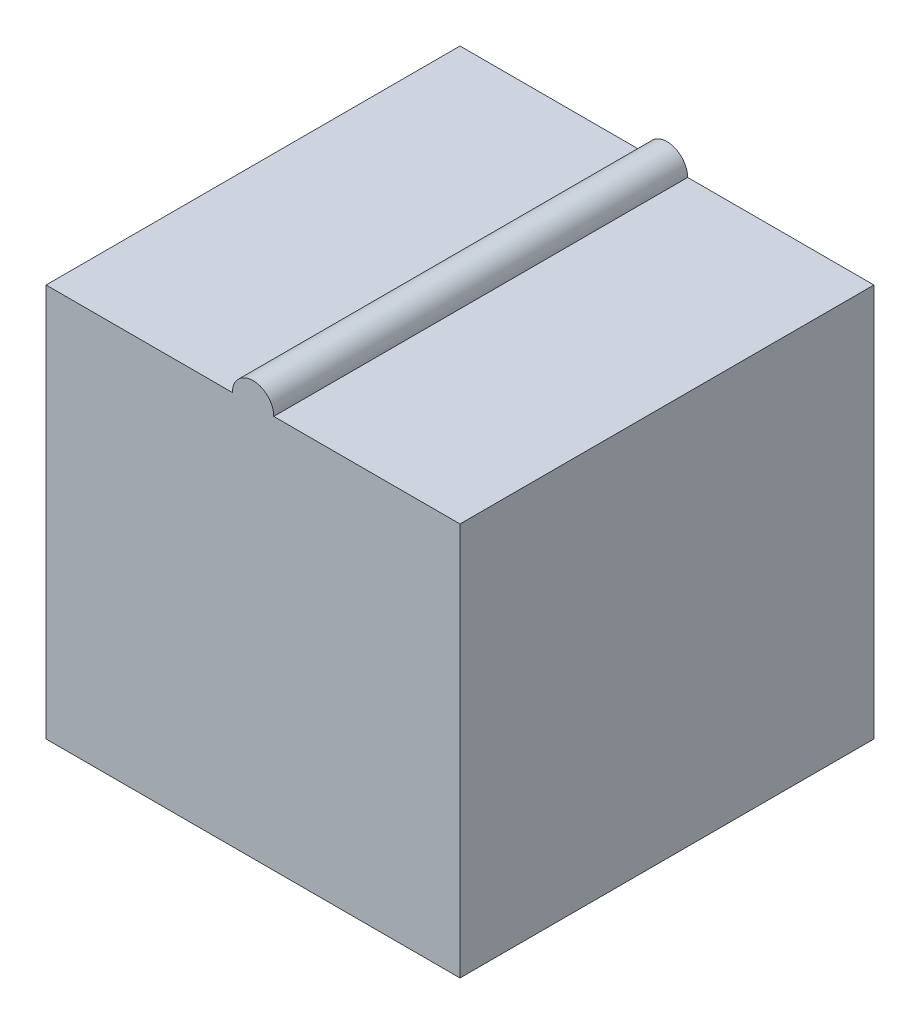
ISO-10303-21;
HEADER;
FILE_DESCRIPTION(('STEP AP214'),'2;1');
FILE_NAME('part.step','',(''),(''),'','','');
FILE_SCHEMA(('AUTOMOTIVE_DESIGN { 1 0 10303 214 1 1 1 1 }'));
ENDSEC;
DATA;
#1=APPLICATION_CONTEXT('core data for automotive mechanical design processes');
#2=APPLICATION_PROTOCOL_DEFINITION('international standard','automotive_design',2000,#1);
#3=PRODUCT_CONTEXT('',#1,'mechanical');
#4=PRODUCT('Part','Part','',(#3));
#5=PRODUCT_RELATED_PRODUCT_CATEGORY('part','',(#4));
#6=PRODUCT_DEFINITION_FORMATION('','',#4);
#7=PRODUCT_DEFINITION_CONTEXT('part definition',#1,'design');
#8=PRODUCT_DEFINITION('design','',#6,#7);
#9=PRODUCT_DEFINITION_SHAPE('','',#8);
#10=(LENGTH_UNIT() NAMED_UNIT(*) SI_UNIT(.MILLI.,.METRE.));
#11=(NAMED_UNIT(*) PLANE_ANGLE_UNIT() SI_UNIT($,.RADIAN.));
#12=(NAMED_UNIT(*) SI_UNIT($,.STERADIAN.) SOLID_ANGLE_UNIT());
#13=UNCERTAINTY_MEASURE_WITH_UNIT(LENGTH_MEASURE(1.E-05),#10,'distance_accuracy_value','');
#14=(GEOMETRIC_REPRESENTATION_CONTEXT(3) GLOBAL_UNCERTAINTY_ASSIGNED_CONTEXT((#13)) GLOBAL_UNIT_ASSIGNED_CONTEXT((#10,
#11,#12)) REPRESENTATION_CONTEXT('',''));
#15=CARTESIAN_POINT('',(0.,0.,0.));
#16=DIRECTION('',(0.,0.,1.));
#17=DIRECTION('',(1.,0.,0.));
#18=AXIS2_PLACEMENT_3D('',#15,#16,#17);
#19=CARTESIAN_POINT('',(0.,0.,20.));
#20=DIRECTION('',(1.,0.,0.));
#21=DIRECTION('',(0.,0.,-1.));
#22=AXIS2_PLACEMENT_3D('',#19,#20,#21);
#23=PLANE('',#22);
#24=DIRECTION('',(0.,-1.,0.));
#25=VECTOR('',#24,1.);
#26=CARTESIAN_POINT('',(0.,0.,0.));
#27=LINE('',#26,#25);
#28=CARTESIAN_POINT('',(0.,19.,0.));
#29=VERTEX_POINT('',#28);
#30=CARTESIAN_POINT('',(0.,0.,0.));
#31=VERTEX_POINT('',#30);
#32=EDGE_CURVE('E117',#29,#31,#27,.T.);
#33=ORIENTED_EDGE('',*,*,#32,.T.);
#34=DIRECTION('',(0.,0.,-1.));
#35=VECTOR('',#34,1.);
#36=CARTESIAN_POINT('',(0.,0.,20.));
#37=LINE('',#36,#35);
#38=CARTESIAN_POINT('',(0.,0.,20.));
#39=VERTEX_POINT('',#38);
#40=EDGE_CURVE('E11',#39,#31,#37,.T.);
#41=ORIENTED_EDGE('',*,*,#40,.F.);
#42=DIRECTION('',(0.,-1.,0.));
#43=VECTOR('',#42,1.);
#44=CARTESIAN_POINT('',(0.,0.,20.));
#45=LINE('',#44,#43);
#46=CARTESIAN_POINT('',(0.,19.,20.));
#47=VERTEX_POINT('',#46);
#48=EDGE_CURVE('E127',#47,#39,#45,.T.);
#49=ORIENTED_EDGE('',*,*,#48,.F.);
#50=DIRECTION('',(0.,0.,-1.));
#51=VECTOR('',#50,1.);
#52=CARTESIAN_POINT('',(0.,19.,20.));
#53=LINE('',#52,#51);
#54=EDGE_CURVE('E113',#47,#29,#53,.T.);
#55=ORIENTED_EDGE('',*,*,#54,.T.);
#56=EDGE_LOOP('',(#33,#41,#49,#55));
#57=FACE_BOUND('',#56,.T.);
#58=ADVANCED_FACE('F33',(#57),#23,.F.);
#59=CARTESIAN_POINT('',(0.,0.,20.));
#60=DIRECTION('',(0.,1.,0.));
#61=DIRECTION('',(0.,0.,1.));
#62=AXIS2_PLACEMENT_3D('',#59,#60,#61);
#63=PLANE('',#62);
#64=DIRECTION('',(1.,0.,0.));
#65=VECTOR('',#64,1.);
#66=CARTESIAN_POINT('',(0.,0.,0.));
#67=LINE('',#66,#65);
#68=CARTESIAN_POINT('',(20.,0.,0.));
#69=VERTEX_POINT('',#68);
#70=EDGE_CURVE('E120',#31,#69,#67,.T.);
#71=ORIENTED_EDGE('',*,*,#70,.T.);
#72=DIRECTION('',(0.,0.,-1.));
#73=VECTOR('',#72,1.);
#74=CARTESIAN_POINT('',(20.,0.,20.));
#75=LINE('',#74,#73);
#76=CARTESIAN_POINT('',(20.,0.,20.));
#77=VERTEX_POINT('',#76);
#78=EDGE_CURVE('E41',#77,#69,#75,.T.);
#79=ORIENTED_EDGE('',*,*,#78,.F.);
#80=DIRECTION('',(1.,0.,0.));
#81=VECTOR('',#80,1.);
#82=CARTESIAN_POINT('',(0.,0.,20.));
#83=LINE('',#82,#81);
#84=EDGE_CURVE('E86',#39,#77,#83,.T.);
#85=ORIENTED_EDGE('',*,*,#84,.F.);
#86=ORIENTED_EDGE('',*,*,#40,.T.);
#87=EDGE_LOOP('',(#71,#79,#85,#86));
#88=FACE_BOUND('',#87,.T.);
#89=ADVANCED_FACE('F151',(#88),#63,.F.);
#90=CARTESIAN_POINT('',(20.,0.,20.));
#91=DIRECTION('',(-1.,0.,0.));
#92=DIRECTION('',(0.,0.,1.));
#93=AXIS2_PLACEMENT_3D('',#90,#91,#92);
#94=PLANE('',#93);
#95=DIRECTION('',(0.,1.,0.));
#96=VECTOR('',#95,1.);
#97=CARTESIAN_POINT('',(20.,0.,0.));
#98=LINE('',#97,#96);
#99=CARTESIAN_POINT('',(20.,19.,0.));
#100=VERTEX_POINT('',#99);
#101=EDGE_CURVE('E122',#69,#100,#98,.T.);
#102=ORIENTED_EDGE('',*,*,#101,.T.);
#103=DIRECTION('',(0.,0.,-1.));
#104=VECTOR('',#103,1.);
#105=CARTESIAN_POINT('',(20.,19.,20.));
#106=LINE('',#105,#104);
#107=CARTESIAN_POINT('',(20.,19.,20.));
#108=VERTEX_POINT('',#107);
#109=EDGE_CURVE('E108',#108,#100,#106,.T.);
#110=ORIENTED_EDGE('',*,*,#109,.F.);
#111=DIRECTION('',(0.,1.,0.));
#112=VECTOR('',#111,1.);
#113=CARTESIAN_POINT('',(20.,0.,20.));
#114=LINE('',#113,#112);
#115=EDGE_CURVE('E99',#77,#108,#114,.T.);
#116=ORIENTED_EDGE('',*,*,#115,.F.);
#117=ORIENTED_EDGE('',*,*,#78,.T.);
#118=EDGE_LOOP('',(#102,#110,#116,#117));
#119=FACE_BOUND('',#118,.T.);
#120=ADVANCED_FACE('F133',(#119),#94,.F.);
#121=CARTESIAN_POINT('',(11.,19.,20.));
#122=DIRECTION('',(0.,-1.,0.));
#123=DIRECTION('',(0.,0.,-1.));
#124=AXIS2_PLACEMENT_3D('',#121,#122,#123);
#125=PLANE('',#124);
#126=DIRECTION('',(-1.,0.,0.));
#127=VECTOR('',#126,1.);
#128=CARTESIAN_POINT('',(11.,19.,0.));
#129=LINE('',#128,#127);
#130=CARTESIAN_POINT('',(11.,19.,0.));
#131=VERTEX_POINT('',#130);
#132=EDGE_CURVE('E107',#100,#131,#129,.T.);
#133=ORIENTED_EDGE('',*,*,#132,.T.);
#134=DIRECTION('',(0.,0.,-1.));
#135=VECTOR('',#134,1.);
#136=CARTESIAN_POINT('',(11.,19.,20.));
#137=LINE('',#136,#135);
#138=CARTESIAN_POINT('',(11.,19.,20.));
#139=VERTEX_POINT('',#138);
#140=EDGE_CURVE('E104',#139,#131,#137,.T.);
#141=ORIENTED_EDGE('',*,*,#140,.F.);
#142=DIRECTION('',(-1.,0.,0.));
#143=VECTOR('',#142,1.);
#144=CARTESIAN_POINT('',(11.,19.,20.));
#145=LINE('',#144,#143);
#146=EDGE_CURVE('E93',#108,#139,#145,.T.);
#147=ORIENTED_EDGE('',*,*,#146,.F.);
#148=ORIENTED_EDGE('',*,*,#109,.T.);
#149=EDGE_LOOP('',(#133,#141,#147,#148));
#150=FACE_BOUND('',#149,.T.);
#151=ADVANCED_FACE('F105',(#150),#125,.F.);
#152=CARTESIAN_POINT('',(10.,19.,20.));
#153=DIRECTION('',(0.,0.,-1.));
#154=DIRECTION('',(-1.,0.,0.));
#155=AXIS2_PLACEMENT_3D('',#152,#153,#154);
#156=CYLINDRICAL_SURFACE('',#155,0.999999999999999);
#157=CARTESIAN_POINT('',(10.,19.,0.));
#158=DIRECTION('',(0.,0.,1.));
#159=DIRECTION('',(1.,0.,0.));
#160=AXIS2_PLACEMENT_3D('',#157,#158,#159);
#161=CIRCLE('',#160,0.999999999999999);
#162=CARTESIAN_POINT('',(9.,19.,0.));
#163=VERTEX_POINT('',#162);
#164=EDGE_CURVE('E72',#131,#163,#161,.T.);
#165=ORIENTED_EDGE('',*,*,#164,.T.);
#166=DIRECTION('',(0.,0.,-1.));
#167=VECTOR('',#166,1.);
#168=CARTESIAN_POINT('',(9.,19.,20.));
#169=LINE('',#168,#167);
#170=CARTESIAN_POINT('',(9.,19.,20.));
#171=VERTEX_POINT('',#170);
#172=EDGE_CURVE('E109',#171,#163,#169,.T.);
#173=ORIENTED_EDGE('',*,*,#172,.F.);
#174=CARTESIAN_POINT('',(10.,19.,20.));
#175=DIRECTION('',(0.,0.,1.));
#176=DIRECTION('',(1.,0.,0.));
#177=AXIS2_PLACEMENT_3D('',#174,#175,#176);
#178=CIRCLE('',#177,0.999999999999999);
#179=EDGE_CURVE('E97',#139,#171,#178,.T.);
#180=ORIENTED_EDGE('',*,*,#179,.F.);
#181=ORIENTED_EDGE('',*,*,#140,.T.);
#182=EDGE_LOOP('',(#165,#173,#180,#181));
#183=FACE_BOUND('',#182,.T.);
#184=ADVANCED_FACE('F111',(#183),#156,.T.);
#185=CARTESIAN_POINT('',(0.,19.,20.));
#186=DIRECTION('',(0.,-1.,0.));
#187=DIRECTION('',(1.,0.,0.));
#188=AXIS2_PLACEMENT_3D('',#185,#186,#187);
#189=PLANE('',#188);
#190=DIRECTION('',(-1.,0.,0.));
#191=VECTOR('',#190,1.);
#192=CARTESIAN_POINT('',(0.,19.,0.));
#193=LINE('',#192,#191);
#194=EDGE_CURVE('E78',#163,#29,#193,.T.);
#195=ORIENTED_EDGE('',*,*,#194,.T.);
#196=ORIENTED_EDGE('',*,*,#54,.F.);
#197=DIRECTION('',(-1.,0.,0.));
#198=VECTOR('',#197,1.);
#199=CARTESIAN_POINT('',(0.,19.,20.));
#200=LINE('',#199,#198);
#201=EDGE_CURVE('E49',#171,#47,#200,.T.);
#202=ORIENTED_EDGE('',*,*,#201,.F.);
#203=ORIENTED_EDGE('',*,*,#172,.T.);
#204=EDGE_LOOP('',(#195,#196,#202,#203));
#205=FACE_BOUND('',#204,.T.);
#206=ADVANCED_FACE('F140',(#205),#189,.F.);
#207=CARTESIAN_POINT('',(10.,19.,20.));
#208=DIRECTION('',(0.,0.,1.));
#209=DIRECTION('',(1.,0.,0.));
#210=AXIS2_PLACEMENT_3D('',#207,#208,#209);
#211=PLANE('',#210);
#212=ORIENTED_EDGE('',*,*,#48,.T.);
#213=ORIENTED_EDGE('',*,*,#84,.T.);
#214=ORIENTED_EDGE('',*,*,#115,.T.);
#215=ORIENTED_EDGE('',*,*,#146,.T.);
#216=ORIENTED_EDGE('',*,*,#179,.T.);
#217=ORIENTED_EDGE('',*,*,#201,.T.);
#218=EDGE_LOOP('',(#212,#213,#214,#215,#216,#217));
#219=FACE_BOUND('',#218,.T.);
#220=ADVANCED_FACE('F95',(#219),#211,.T.);
#221=CARTESIAN_POINT('',(10.,19.,0.));
#222=DIRECTION('',(0.,0.,1.));
#223=DIRECTION('',(1.,0.,0.));
#224=AXIS2_PLACEMENT_3D('',#221,#222,#223);
#225=PLANE('',#224);
#226=ORIENTED_EDGE('',*,*,#32,.F.);
#227=ORIENTED_EDGE('',*,*,#194,.F.);
#228=ORIENTED_EDGE('',*,*,#164,.F.);
#229=ORIENTED_EDGE('',*,*,#132,.F.);
#230=ORIENTED_EDGE('',*,*,#101,.F.);
#231=ORIENTED_EDGE('',*,*,#70,.F.);
#232=EDGE_LOOP('',(#226,#227,#228,#229,#230,#231));
#233=FACE_BOUND('',#232,.T.);
#234=ADVANCED_FACE('F136',(#233),#225,.F.);
#235=CLOSED_SHELL('',(#58,#89,#120,#151,#184,#206,#220,#234));
#236=MANIFOLD_SOLID_BREP('B2',#235);
#237=ADVANCED_BREP_SHAPE_REPRESENTATION('',(#18,#236),#14);
#238=SHAPE_DEFINITION_REPRESENTATION(#9,#237);
ENDSEC;
END-ISO-10303-21;
